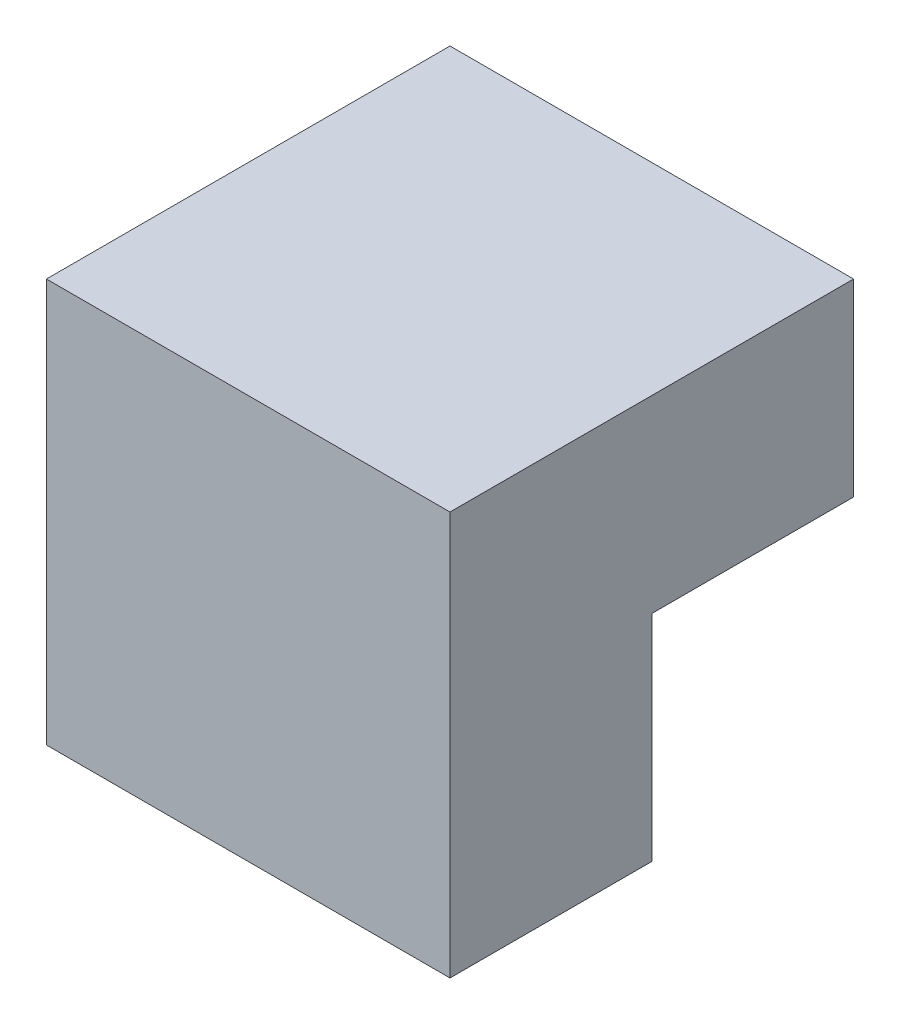
ISO-10303-21;
HEADER;
FILE_DESCRIPTION(('STEP AP214'),'2;1');
FILE_NAME('part.step','',(''),(''),'','','');
FILE_SCHEMA(('AUTOMOTIVE_DESIGN { 1 0 10303 214 1 1 1 1 }'));
ENDSEC;
DATA;
#1=APPLICATION_CONTEXT('core data for automotive mechanical design processes');
#2=APPLICATION_PROTOCOL_DEFINITION('international standard','automotive_design',2000,#1);
#3=PRODUCT_CONTEXT('',#1,'mechanical');
#4=PRODUCT('Part','Part','',(#3));
#5=PRODUCT_RELATED_PRODUCT_CATEGORY('part','',(#4));
#6=PRODUCT_DEFINITION_FORMATION('','',#4);
#7=PRODUCT_DEFINITION_CONTEXT('part definition',#1,'design');
#8=PRODUCT_DEFINITION('design','',#6,#7);
#9=PRODUCT_DEFINITION_SHAPE('','',#8);
#10=(LENGTH_UNIT() NAMED_UNIT(*) SI_UNIT(.MILLI.,.METRE.));
#11=(NAMED_UNIT(*) PLANE_ANGLE_UNIT() SI_UNIT($,.RADIAN.));
#12=(NAMED_UNIT(*) SI_UNIT($,.STERADIAN.) SOLID_ANGLE_UNIT());
#13=UNCERTAINTY_MEASURE_WITH_UNIT(LENGTH_MEASURE(1.E-05),#10,'distance_accuracy_value','');
#14=(GEOMETRIC_REPRESENTATION_CONTEXT(3) GLOBAL_UNCERTAINTY_ASSIGNED_CONTEXT((#13)) GLOBAL_UNIT_ASSIGNED_CONTEXT((#10,
#11,#12)) REPRESENTATION_CONTEXT('',''));
#15=CARTESIAN_POINT('',(0.,0.,0.));
#16=DIRECTION('',(0.,0.,1.));
#17=DIRECTION('',(1.,0.,0.));
#18=AXIS2_PLACEMENT_3D('',#15,#16,#17);
#19=CARTESIAN_POINT('',(-7.3065830905506,6.51238927636032,20.));
#20=DIRECTION('',(1.,0.,0.));
#21=DIRECTION('',(0.,1.,0.));
#22=AXIS2_PLACEMENT_3D('',#19,#20,#21);
#23=PLANE('',#22);
#24=DIRECTION('',(0.,0.,-1.));
#25=VECTOR('',#24,1.);
#26=CARTESIAN_POINT('',(-7.3065830905506,-3.37203362567894,10.));
#27=LINE('',#26,#25);
#28=CARTESIAN_POINT('',(-7.3065830905506,-3.37203362567894,10.));
#29=VERTEX_POINT('',#28);
#30=CARTESIAN_POINT('',(-7.3065830905506,-3.37203362567894,0.));
#31=VERTEX_POINT('',#30);
#32=EDGE_CURVE('E49',#29,#31,#27,.T.);
#33=ORIENTED_EDGE('',*,*,#32,.F.);
#34=DIRECTION('',(0.,-1.,0.));
#35=VECTOR('',#34,1.);
#36=CARTESIAN_POINT('',(-7.3065830905506,6.51238927636032,10.));
#37=LINE('',#36,#35);
#38=CARTESIAN_POINT('',(-7.3065830905506,-13.4876107236397,10.));
#39=VERTEX_POINT('',#38);
#40=EDGE_CURVE('E108',#29,#39,#37,.T.);
#41=ORIENTED_EDGE('',*,*,#40,.T.);
#42=DIRECTION('',(0.,0.,-1.));
#43=VECTOR('',#42,1.);
#44=CARTESIAN_POINT('',(-7.3065830905506,-13.4876107236397,20.));
#45=LINE('',#44,#43);
#46=CARTESIAN_POINT('',(-7.3065830905506,-13.4876107236397,20.));
#47=VERTEX_POINT('',#46);
#48=EDGE_CURVE('E42',#47,#39,#45,.T.);
#49=ORIENTED_EDGE('',*,*,#48,.F.);
#50=DIRECTION('',(0.,-1.,0.));
#51=VECTOR('',#50,1.);
#52=CARTESIAN_POINT('',(-7.3065830905506,6.51238927636032,20.));
#53=LINE('',#52,#51);
#54=CARTESIAN_POINT('',(-7.3065830905506,6.51238927636032,20.));
#55=VERTEX_POINT('',#54);
#56=EDGE_CURVE('E123',#55,#47,#53,.T.);
#57=ORIENTED_EDGE('',*,*,#56,.F.);
#58=DIRECTION('',(0.,0.,-1.));
#59=VECTOR('',#58,1.);
#60=CARTESIAN_POINT('',(-7.3065830905506,6.51238927636032,20.));
#61=LINE('',#60,#59);
#62=CARTESIAN_POINT('',(-7.3065830905506,6.51238927636032,0.));
#63=VERTEX_POINT('',#62);
#64=EDGE_CURVE('E118',#55,#63,#61,.T.);
#65=ORIENTED_EDGE('',*,*,#64,.T.);
#66=DIRECTION('',(0.,-1.,0.));
#67=VECTOR('',#66,1.);
#68=CARTESIAN_POINT('',(-7.3065830905506,6.51238927636032,0.));
#69=LINE('',#68,#67);
#70=EDGE_CURVE('E126',#63,#31,#69,.T.);
#71=ORIENTED_EDGE('',*,*,#70,.T.);
#72=EDGE_LOOP('',(#33,#41,#49,#57,#65,#71));
#73=FACE_BOUND('',#72,.T.);
#74=ADVANCED_FACE('F35',(#73),#23,.F.);
#75=CARTESIAN_POINT('',(12.6934169094494,6.51238927636032,20.));
#76=DIRECTION('',(-1.,0.,0.));
#77=DIRECTION('',(0.,-1.,0.));
#78=AXIS2_PLACEMENT_3D('',#75,#76,#77);
#79=PLANE('',#78);
#80=DIRECTION('',(0.,0.,-1.));
#81=VECTOR('',#80,1.);
#82=CARTESIAN_POINT('',(12.6934169094494,-2.84562502478329,10.));
#83=LINE('',#82,#81);
#84=CARTESIAN_POINT('',(12.6934169094494,-2.84562502478329,0.));
#85=VERTEX_POINT('',#84);
#86=CARTESIAN_POINT('',(12.6934169094494,-2.84562502478329,10.));
#87=VERTEX_POINT('',#86);
#88=EDGE_CURVE('E96',#85,#87,#83,.F.);
#89=ORIENTED_EDGE('',*,*,#88,.F.);
#90=DIRECTION('',(0.,1.,0.));
#91=VECTOR('',#90,1.);
#92=CARTESIAN_POINT('',(12.6934169094494,6.51238927636032,0.));
#93=LINE('',#92,#91);
#94=CARTESIAN_POINT('',(12.6934169094494,6.51238927636032,0.));
#95=VERTEX_POINT('',#94);
#96=EDGE_CURVE('E124',#85,#95,#93,.T.);
#97=ORIENTED_EDGE('',*,*,#96,.T.);
#98=DIRECTION('',(0.,0.,-1.));
#99=VECTOR('',#98,1.);
#100=CARTESIAN_POINT('',(12.6934169094494,6.51238927636032,20.));
#101=LINE('',#100,#99);
#102=CARTESIAN_POINT('',(12.6934169094494,6.51238927636032,20.));
#103=VERTEX_POINT('',#102);
#104=EDGE_CURVE('E116',#103,#95,#101,.T.);
#105=ORIENTED_EDGE('',*,*,#104,.F.);
#106=DIRECTION('',(0.,1.,0.));
#107=VECTOR('',#106,1.);
#108=CARTESIAN_POINT('',(12.6934169094494,6.51238927636032,20.));
#109=LINE('',#108,#107);
#110=CARTESIAN_POINT('',(12.6934169094494,-13.4876107236397,20.));
#111=VERTEX_POINT('',#110);
#112=EDGE_CURVE('E115',#111,#103,#109,.T.);
#113=ORIENTED_EDGE('',*,*,#112,.F.);
#114=DIRECTION('',(0.,0.,-1.));
#115=VECTOR('',#114,1.);
#116=CARTESIAN_POINT('',(12.6934169094494,-13.4876107236397,20.));
#117=LINE('',#116,#115);
#118=CARTESIAN_POINT('',(12.6934169094494,-13.4876107236397,10.));
#119=VERTEX_POINT('',#118);
#120=EDGE_CURVE('E113',#111,#119,#117,.T.);
#121=ORIENTED_EDGE('',*,*,#120,.T.);
#122=DIRECTION('',(0.,1.,0.));
#123=VECTOR('',#122,1.);
#124=CARTESIAN_POINT('',(12.6934169094494,6.51238927636032,10.));
#125=LINE('',#124,#123);
#126=EDGE_CURVE('E11',#119,#87,#125,.T.);
#127=ORIENTED_EDGE('',*,*,#126,.T.);
#128=EDGE_LOOP('',(#89,#97,#105,#113,#121,#127));
#129=FACE_BOUND('',#128,.T.);
#130=ADVANCED_FACE('F111',(#129),#79,.F.);
#131=CARTESIAN_POINT('',(0.,0.,0.));
#132=DIRECTION('',(0.,0.,1.));
#133=DIRECTION('',(1.,0.,0.));
#134=AXIS2_PLACEMENT_3D('',#131,#132,#133);
#135=PLANE('',#134);
#136=CARTESIAN_POINT('',(3.98238436935586,-52.0809569733488,0.));
#137=DIRECTION('',(0.,0.,1.));
#138=DIRECTION('',(1.,0.,0.));
#139=AXIS2_PLACEMENT_3D('',#136,#137,#138);
#140=CIRCLE('',#139,50.);
#141=EDGE_CURVE('E100',#85,#31,#140,.T.);
#142=ORIENTED_EDGE('',*,*,#141,.T.);
#143=ORIENTED_EDGE('',*,*,#70,.F.);
#144=DIRECTION('',(-1.,0.,0.));
#145=VECTOR('',#144,1.);
#146=CARTESIAN_POINT('',(-7.3065830905506,6.51238927636032,0.));
#147=LINE('',#146,#145);
#148=EDGE_CURVE('E73',#95,#63,#147,.T.);
#149=ORIENTED_EDGE('',*,*,#148,.F.);
#150=ORIENTED_EDGE('',*,*,#96,.F.);
#151=EDGE_LOOP('',(#142,#143,#149,#150));
#152=FACE_BOUND('',#151,.T.);
#153=ADVANCED_FACE('F139',(#152),#135,.F.);
#154=CARTESIAN_POINT('',(-7.3065830905506,-13.4876107236397,20.));
#155=DIRECTION('',(0.,1.,0.));
#156=DIRECTION('',(0.,0.,1.));
#157=AXIS2_PLACEMENT_3D('',#154,#155,#156);
#158=PLANE('',#157);
#159=ORIENTED_EDGE('',*,*,#48,.T.);
#160=DIRECTION('',(1.,0.,0.));
#161=VECTOR('',#160,1.);
#162=CARTESIAN_POINT('',(-7.3065830905506,-13.4876107236397,10.));
#163=LINE('',#162,#161);
#164=EDGE_CURVE('E134',#39,#119,#163,.T.);
#165=ORIENTED_EDGE('',*,*,#164,.T.);
#166=ORIENTED_EDGE('',*,*,#120,.F.);
#167=DIRECTION('',(1.,0.,0.));
#168=VECTOR('',#167,1.);
#169=CARTESIAN_POINT('',(-7.3065830905506,-13.4876107236397,20.));
#170=LINE('',#169,#168);
#171=EDGE_CURVE('E81',#47,#111,#170,.T.);
#172=ORIENTED_EDGE('',*,*,#171,.F.);
#173=EDGE_LOOP('',(#159,#165,#166,#172));
#174=FACE_BOUND('',#173,.T.);
#175=ADVANCED_FACE('F146',(#174),#158,.F.);
#176=CARTESIAN_POINT('',(-7.3065830905506,6.51238927636032,20.));
#177=DIRECTION('',(0.,-1.,0.));
#178=DIRECTION('',(0.,0.,-1.));
#179=AXIS2_PLACEMENT_3D('',#176,#177,#178);
#180=PLANE('',#179);
#181=ORIENTED_EDGE('',*,*,#148,.T.);
#182=ORIENTED_EDGE('',*,*,#64,.F.);
#183=DIRECTION('',(-1.,0.,0.));
#184=VECTOR('',#183,1.);
#185=CARTESIAN_POINT('',(-7.3065830905506,6.51238927636032,20.));
#186=LINE('',#185,#184);
#187=EDGE_CURVE('E58',#103,#55,#186,.T.);
#188=ORIENTED_EDGE('',*,*,#187,.F.);
#189=ORIENTED_EDGE('',*,*,#104,.T.);
#190=EDGE_LOOP('',(#181,#182,#188,#189));
#191=FACE_BOUND('',#190,.T.);
#192=ADVANCED_FACE('F143',(#191),#180,.F.);
#193=CARTESIAN_POINT('',(0.,0.,20.));
#194=DIRECTION('',(0.,0.,1.));
#195=DIRECTION('',(1.,0.,0.));
#196=AXIS2_PLACEMENT_3D('',#193,#194,#195);
#197=PLANE('',#196);
#198=ORIENTED_EDGE('',*,*,#56,.T.);
#199=ORIENTED_EDGE('',*,*,#171,.T.);
#200=ORIENTED_EDGE('',*,*,#112,.T.);
#201=ORIENTED_EDGE('',*,*,#187,.T.);
#202=EDGE_LOOP('',(#198,#199,#200,#201));
#203=FACE_BOUND('',#202,.T.);
#204=ADVANCED_FACE('F145',(#203),#197,.T.);
#205=CARTESIAN_POINT('',(3.98238436935586,-52.0809569733488,10.));
#206=DIRECTION('',(0.,0.,1.));
#207=DIRECTION('',(1.,0.,0.));
#208=AXIS2_PLACEMENT_3D('',#205,#206,#207);
#209=PLANE('',#208);
#210=CARTESIAN_POINT('',(3.98238436935586,-52.0809569733488,10.));
#211=DIRECTION('',(0.,0.,1.));
#212=DIRECTION('',(1.,0.,0.));
#213=AXIS2_PLACEMENT_3D('',#210,#211,#212);
#214=CIRCLE('',#213,50.);
#215=EDGE_CURVE('E99',#87,#29,#214,.T.);
#216=ORIENTED_EDGE('',*,*,#215,.F.);
#217=ORIENTED_EDGE('',*,*,#126,.F.);
#218=ORIENTED_EDGE('',*,*,#164,.F.);
#219=ORIENTED_EDGE('',*,*,#40,.F.);
#220=EDGE_LOOP('',(#216,#217,#218,#219));
#221=FACE_BOUND('',#220,.T.);
#222=ADVANCED_FACE('F105',(#221),#209,.F.);
#223=CARTESIAN_POINT('',(3.98238436935586,-52.0809569733488,10.));
#224=DIRECTION('',(0.,0.,-1.));
#225=DIRECTION('',(-1.,0.,0.));
#226=AXIS2_PLACEMENT_3D('',#223,#224,#225);
#227=CYLINDRICAL_SURFACE('',#226,50.);
#228=ORIENTED_EDGE('',*,*,#32,.T.);
#229=ORIENTED_EDGE('',*,*,#141,.F.);
#230=ORIENTED_EDGE('',*,*,#88,.T.);
#231=ORIENTED_EDGE('',*,*,#215,.T.);
#232=EDGE_LOOP('',(#228,#229,#230,#231));
#233=FACE_BOUND('',#232,.T.);
#234=ADVANCED_FACE('F98',(#233),#227,.F.);
#235=CLOSED_SHELL('',(#74,#130,#153,#175,#192,#204,#222,#234));
#236=MANIFOLD_SOLID_BREP('B2',#235);
#237=ADVANCED_BREP_SHAPE_REPRESENTATION('',(#18,#236),#14);
#238=SHAPE_DEFINITION_REPRESENTATION(#9,#237);
ENDSEC;
END-ISO-10303-21;
